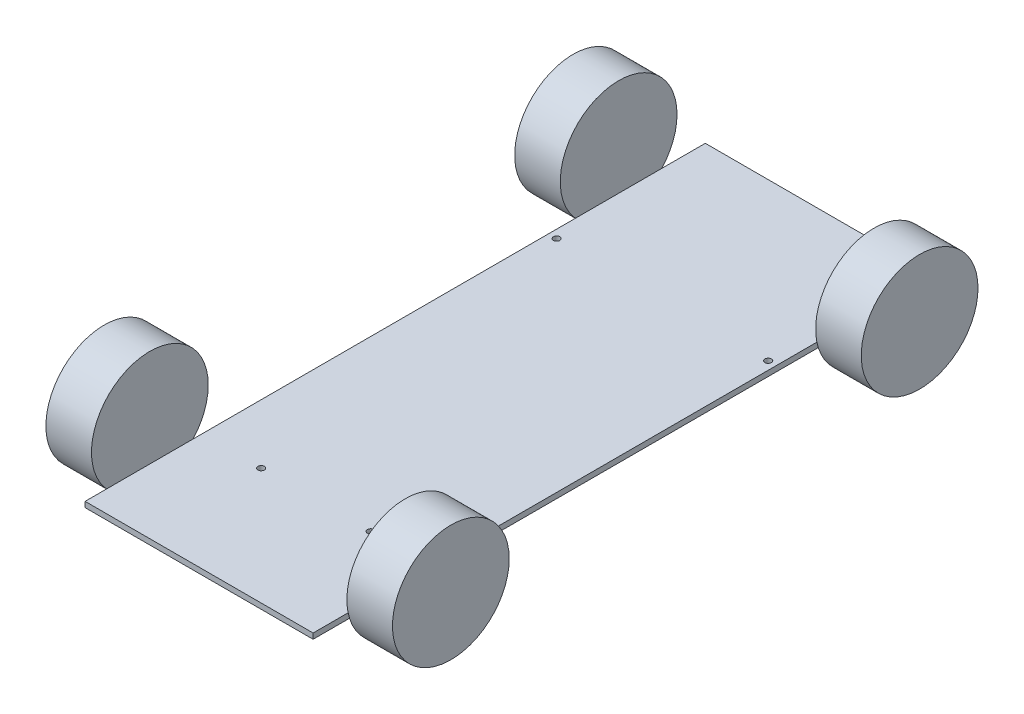
ISO-10303-21;
HEADER;
FILE_DESCRIPTION(('STEP AP214'),'2;1');
FILE_NAME('part.step','',(''),(''),'','','');
FILE_SCHEMA(('AUTOMOTIVE_DESIGN { 1 0 10303 214 1 1 1 1 }'));
ENDSEC;
DATA;
#1=APPLICATION_CONTEXT('core data for automotive mechanical design processes');
#2=APPLICATION_PROTOCOL_DEFINITION('international standard','automotive_design',2000,#1);
#3=PRODUCT_CONTEXT('',#1,'mechanical');
#4=PRODUCT('Part','Part','',(#3));
#5=PRODUCT_RELATED_PRODUCT_CATEGORY('part','',(#4));
#6=PRODUCT_DEFINITION_FORMATION('','',#4);
#7=PRODUCT_DEFINITION_CONTEXT('part definition',#1,'design');
#8=PRODUCT_DEFINITION('design','',#6,#7);
#9=PRODUCT_DEFINITION_SHAPE('','',#8);
#10=(LENGTH_UNIT() NAMED_UNIT(*) SI_UNIT(.MILLI.,.METRE.));
#11=(NAMED_UNIT(*) PLANE_ANGLE_UNIT() SI_UNIT($,.RADIAN.));
#12=(NAMED_UNIT(*) SI_UNIT($,.STERADIAN.) SOLID_ANGLE_UNIT());
#13=UNCERTAINTY_MEASURE_WITH_UNIT(LENGTH_MEASURE(1.E-05),#10,'distance_accuracy_value','');
#14=(GEOMETRIC_REPRESENTATION_CONTEXT(3) GLOBAL_UNCERTAINTY_ASSIGNED_CONTEXT((#13)) GLOBAL_UNIT_ASSIGNED_CONTEXT((#10,
#11,#12)) REPRESENTATION_CONTEXT('',''));
#15=CARTESIAN_POINT('',(0.,0.,0.));
#16=DIRECTION('',(0.,0.,1.));
#17=DIRECTION('',(1.,0.,0.));
#18=AXIS2_PLACEMENT_3D('',#15,#16,#17);
#19=CARTESIAN_POINT('',(-95.,17.,127.));
#20=DIRECTION('',(1.,0.,0.));
#21=DIRECTION('',(0.,0.,1.));
#22=AXIS2_PLACEMENT_3D('',#19,#20,#21);
#23=CYLINDRICAL_SURFACE('',#22,32.);
#24=CARTESIAN_POINT('',(-95.,17.,127.));
#25=DIRECTION('',(1.,0.,0.));
#26=DIRECTION('',(0.,0.,-1.));
#27=AXIS2_PLACEMENT_3D('',#24,#25,#26);
#28=CIRCLE('',#27,32.);
#29=CARTESIAN_POINT('',(-95.,17.,95.));
#30=VERTEX_POINT('',#29);
#31=EDGE_CURVE('E11',#30,#30,#28,.T.);
#32=ORIENTED_EDGE('',*,*,#31,.T.);
#33=EDGE_LOOP('',(#32));
#34=FACE_BOUND('',#33,.T.);
#35=CARTESIAN_POINT('',(-70.,17.,127.));
#36=DIRECTION('',(1.,0.,0.));
#37=DIRECTION('',(0.,0.,-1.));
#38=AXIS2_PLACEMENT_3D('',#35,#36,#37);
#39=CIRCLE('',#38,32.);
#40=CARTESIAN_POINT('',(-70.,17.,95.));
#41=VERTEX_POINT('',#40);
#42=EDGE_CURVE('E42',#41,#41,#39,.T.);
#43=ORIENTED_EDGE('',*,*,#42,.F.);
#44=EDGE_LOOP('',(#43));
#45=FACE_BOUND('',#44,.T.);
#46=ADVANCED_FACE('F39',(#34,#45),#23,.T.);
#47=CARTESIAN_POINT('',(-95.,17.,127.));
#48=DIRECTION('',(-1.,0.,0.));
#49=DIRECTION('',(0.,0.,-1.));
#50=AXIS2_PLACEMENT_3D('',#47,#48,#49);
#51=PLANE('',#50);
#52=ORIENTED_EDGE('',*,*,#31,.F.);
#53=EDGE_LOOP('',(#52));
#54=FACE_BOUND('',#53,.T.);
#55=ADVANCED_FACE('F54',(#54),#51,.T.);
#56=CARTESIAN_POINT('',(-70.,17.,127.));
#57=DIRECTION('',(-1.,0.,0.));
#58=DIRECTION('',(0.,0.,-1.));
#59=AXIS2_PLACEMENT_3D('',#56,#57,#58);
#60=PLANE('',#59);
#61=ORIENTED_EDGE('',*,*,#42,.T.);
#62=EDGE_LOOP('',(#61));
#63=FACE_BOUND('',#62,.T.);
#64=ADVANCED_FACE('F51',(#63),#60,.F.);
#65=CLOSED_SHELL('',(#46,#55,#64));
#66=MANIFOLD_SOLID_BREP('B2',#65);
#67=CARTESIAN_POINT('',(-95.,17.,-130.));
#68=DIRECTION('',(1.,0.,0.));
#69=DIRECTION('',(0.,0.,1.));
#70=AXIS2_PLACEMENT_3D('',#67,#68,#69);
#71=CYLINDRICAL_SURFACE('',#70,32.);
#72=CARTESIAN_POINT('',(-95.,17.,-130.));
#73=DIRECTION('',(1.,0.,0.));
#74=DIRECTION('',(0.,0.,-1.));
#75=AXIS2_PLACEMENT_3D('',#72,#73,#74);
#76=CIRCLE('',#75,32.);
#77=CARTESIAN_POINT('',(-95.,17.,-162.));
#78=VERTEX_POINT('',#77);
#79=EDGE_CURVE('E38',#78,#78,#76,.T.);
#80=ORIENTED_EDGE('',*,*,#79,.T.);
#81=EDGE_LOOP('',(#80));
#82=FACE_BOUND('',#81,.T.);
#83=CARTESIAN_POINT('',(-70.,17.,-130.));
#84=DIRECTION('',(1.,0.,0.));
#85=DIRECTION('',(0.,0.,-1.));
#86=AXIS2_PLACEMENT_3D('',#83,#84,#85);
#87=CIRCLE('',#86,32.);
#88=CARTESIAN_POINT('',(-70.,17.,-162.));
#89=VERTEX_POINT('',#88);
#90=EDGE_CURVE('E90',#89,#89,#87,.T.);
#91=ORIENTED_EDGE('',*,*,#90,.F.);
#92=EDGE_LOOP('',(#91));
#93=FACE_BOUND('',#92,.T.);
#94=ADVANCED_FACE('F87',(#82,#93),#71,.T.);
#95=CARTESIAN_POINT('',(-95.,17.,-130.));
#96=DIRECTION('',(-1.,0.,0.));
#97=DIRECTION('',(0.,0.,-1.));
#98=AXIS2_PLACEMENT_3D('',#95,#96,#97);
#99=PLANE('',#98);
#100=ORIENTED_EDGE('',*,*,#79,.F.);
#101=EDGE_LOOP('',(#100));
#102=FACE_BOUND('',#101,.T.);
#103=ADVANCED_FACE('F102',(#102),#99,.T.);
#104=CARTESIAN_POINT('',(-70.,17.,-130.));
#105=DIRECTION('',(-1.,0.,0.));
#106=DIRECTION('',(0.,0.,-1.));
#107=AXIS2_PLACEMENT_3D('',#104,#105,#106);
#108=PLANE('',#107);
#109=ORIENTED_EDGE('',*,*,#90,.T.);
#110=EDGE_LOOP('',(#109));
#111=FACE_BOUND('',#110,.T.);
#112=ADVANCED_FACE('F99',(#111),#108,.F.);
#113=CLOSED_SHELL('',(#94,#103,#112));
#114=MANIFOLD_SOLID_BREP('B6',#113);
#115=CARTESIAN_POINT('',(95.,17.,127.));
#116=DIRECTION('',(-1.,0.,0.));
#117=DIRECTION('',(0.,0.,1.));
#118=AXIS2_PLACEMENT_3D('',#115,#116,#117);
#119=CYLINDRICAL_SURFACE('',#118,32.);
#120=CARTESIAN_POINT('',(95.,17.,127.));
#121=DIRECTION('',(1.,0.,0.));
#122=DIRECTION('',(0.,0.,-1.));
#123=AXIS2_PLACEMENT_3D('',#120,#121,#122);
#124=CIRCLE('',#123,32.);
#125=CARTESIAN_POINT('',(95.,17.,95.));
#126=VERTEX_POINT('',#125);
#127=EDGE_CURVE('E86',#126,#126,#124,.T.);
#128=ORIENTED_EDGE('',*,*,#127,.F.);
#129=EDGE_LOOP('',(#128));
#130=FACE_BOUND('',#129,.T.);
#131=CARTESIAN_POINT('',(70.,17.,127.));
#132=DIRECTION('',(1.,0.,0.));
#133=DIRECTION('',(0.,0.,-1.));
#134=AXIS2_PLACEMENT_3D('',#131,#132,#133);
#135=CIRCLE('',#134,32.);
#136=CARTESIAN_POINT('',(70.,17.,95.));
#137=VERTEX_POINT('',#136);
#138=EDGE_CURVE('E138',#137,#137,#135,.T.);
#139=ORIENTED_EDGE('',*,*,#138,.T.);
#140=EDGE_LOOP('',(#139));
#141=FACE_BOUND('',#140,.T.);
#142=ADVANCED_FACE('F135',(#130,#141),#119,.T.);
#143=CARTESIAN_POINT('',(95.,17.,127.));
#144=DIRECTION('',(1.,0.,0.));
#145=DIRECTION('',(0.,0.,-1.));
#146=AXIS2_PLACEMENT_3D('',#143,#144,#145);
#147=PLANE('',#146);
#148=ORIENTED_EDGE('',*,*,#127,.T.);
#149=EDGE_LOOP('',(#148));
#150=FACE_BOUND('',#149,.T.);
#151=ADVANCED_FACE('F150',(#150),#147,.T.);
#152=CARTESIAN_POINT('',(70.,17.,127.));
#153=DIRECTION('',(1.,0.,0.));
#154=DIRECTION('',(0.,0.,-1.));
#155=AXIS2_PLACEMENT_3D('',#152,#153,#154);
#156=PLANE('',#155);
#157=ORIENTED_EDGE('',*,*,#138,.F.);
#158=EDGE_LOOP('',(#157));
#159=FACE_BOUND('',#158,.T.);
#160=ADVANCED_FACE('F148',(#159),#156,.F.);
#161=CLOSED_SHELL('',(#142,#151,#160));
#162=MANIFOLD_SOLID_BREP('B33',#161);
#163=CARTESIAN_POINT('',(95.,17.,-130.));
#164=DIRECTION('',(-1.,0.,0.));
#165=DIRECTION('',(0.,0.,1.));
#166=AXIS2_PLACEMENT_3D('',#163,#164,#165);
#167=CYLINDRICAL_SURFACE('',#166,32.);
#168=CARTESIAN_POINT('',(95.,17.,-130.));
#169=DIRECTION('',(1.,0.,0.));
#170=DIRECTION('',(0.,0.,-1.));
#171=AXIS2_PLACEMENT_3D('',#168,#169,#170);
#172=CIRCLE('',#171,32.);
#173=CARTESIAN_POINT('',(95.,17.,-162.));
#174=VERTEX_POINT('',#173);
#175=EDGE_CURVE('E134',#174,#174,#172,.T.);
#176=ORIENTED_EDGE('',*,*,#175,.F.);
#177=EDGE_LOOP('',(#176));
#178=FACE_BOUND('',#177,.T.);
#179=CARTESIAN_POINT('',(70.,17.,-130.));
#180=DIRECTION('',(1.,0.,0.));
#181=DIRECTION('',(0.,0.,-1.));
#182=AXIS2_PLACEMENT_3D('',#179,#180,#181);
#183=CIRCLE('',#182,32.);
#184=CARTESIAN_POINT('',(70.,17.,-162.));
#185=VERTEX_POINT('',#184);
#186=EDGE_CURVE('E187',#185,#185,#183,.T.);
#187=ORIENTED_EDGE('',*,*,#186,.T.);
#188=EDGE_LOOP('',(#187));
#189=FACE_BOUND('',#188,.T.);
#190=ADVANCED_FACE('F184',(#178,#189),#167,.T.);
#191=CARTESIAN_POINT('',(95.,17.,-130.));
#192=DIRECTION('',(1.,0.,0.));
#193=DIRECTION('',(0.,0.,-1.));
#194=AXIS2_PLACEMENT_3D('',#191,#192,#193);
#195=PLANE('',#194);
#196=ORIENTED_EDGE('',*,*,#175,.T.);
#197=EDGE_LOOP('',(#196));
#198=FACE_BOUND('',#197,.T.);
#199=ADVANCED_FACE('F199',(#198),#195,.T.);
#200=CARTESIAN_POINT('',(70.,17.,-130.));
#201=DIRECTION('',(1.,0.,0.));
#202=DIRECTION('',(0.,0.,-1.));
#203=AXIS2_PLACEMENT_3D('',#200,#201,#202);
#204=PLANE('',#203);
#205=ORIENTED_EDGE('',*,*,#186,.F.);
#206=EDGE_LOOP('',(#205));
#207=FACE_BOUND('',#206,.T.);
#208=ADVANCED_FACE('F197',(#207),#204,.F.);
#209=CLOSED_SHELL('',(#190,#199,#208));
#210=MANIFOLD_SOLID_BREP('B81',#209);
#211=CARTESIAN_POINT('',(0.,3.,0.));
#212=DIRECTION('',(0.,1.,0.));
#213=DIRECTION('',(0.,0.,1.));
#214=AXIS2_PLACEMENT_3D('',#211,#212,#213);
#215=PLANE('',#214);
#216=CARTESIAN_POINT('',(-30.,3.,106.));
#217=DIRECTION('',(0.,1.,0.));
#218=DIRECTION('',(0.,0.,1.));
#219=AXIS2_PLACEMENT_3D('',#216,#217,#218);
#220=CIRCLE('',#219,1.778);
#221=CARTESIAN_POINT('',(-30.,3.,107.778));
#222=VERTEX_POINT('',#221);
#223=EDGE_CURVE('E312',#222,#222,#220,.T.);
#224=ORIENTED_EDGE('',*,*,#223,.F.);
#225=EDGE_LOOP('',(#224));
#226=FACE_BOUND('',#225,.T.);
#227=CARTESIAN_POINT('',(-58.0000000000088,3.,-84.));
#228=DIRECTION('',(0.,1.,0.));
#229=DIRECTION('',(0.,0.,1.));
#230=AXIS2_PLACEMENT_3D('',#227,#228,#229);
#231=CIRCLE('',#230,1.77799999999999);
#232=CARTESIAN_POINT('',(-58.0000000000088,3.,-82.222));
#233=VERTEX_POINT('',#232);
#234=EDGE_CURVE('E291',#233,#233,#231,.T.);
#235=ORIENTED_EDGE('',*,*,#234,.F.);
#236=EDGE_LOOP('',(#235));
#237=FACE_BOUND('',#236,.T.);
#238=DIRECTION('',(0.,0.,-1.));
#239=VECTOR('',#238,1.);
#240=CARTESIAN_POINT('',(62.5,3.,-170.));
#241=LINE('',#240,#239);
#242=CARTESIAN_POINT('',(62.5,3.,170.));
#243=VERTEX_POINT('',#242);
#244=CARTESIAN_POINT('',(62.5,3.,-170.));
#245=VERTEX_POINT('',#244);
#246=EDGE_CURVE('E276',#243,#245,#241,.T.);
#247=ORIENTED_EDGE('',*,*,#246,.T.);
#248=DIRECTION('',(-1.,0.,0.));
#249=VECTOR('',#248,1.);
#250=CARTESIAN_POINT('',(-62.5,3.,-170.));
#251=LINE('',#250,#249);
#252=CARTESIAN_POINT('',(-62.5,3.,-170.));
#253=VERTEX_POINT('',#252);
#254=EDGE_CURVE('E271',#245,#253,#251,.T.);
#255=ORIENTED_EDGE('',*,*,#254,.T.);
#256=DIRECTION('',(0.,0.,1.));
#257=VECTOR('',#256,1.);
#258=CARTESIAN_POINT('',(-62.5,3.,-170.));
#259=LINE('',#258,#257);
#260=CARTESIAN_POINT('',(-62.5,3.,170.));
#261=VERTEX_POINT('',#260);
#262=EDGE_CURVE('E274',#253,#261,#259,.T.);
#263=ORIENTED_EDGE('',*,*,#262,.T.);
#264=DIRECTION('',(1.,0.,0.));
#265=VECTOR('',#264,1.);
#266=CARTESIAN_POINT('',(-62.5,3.,170.));
#267=LINE('',#266,#265);
#268=EDGE_CURVE('E241',#261,#243,#267,.T.);
#269=ORIENTED_EDGE('',*,*,#268,.T.);
#270=EDGE_LOOP('',(#247,#255,#263,#269));
#271=FACE_BOUND('',#270,.T.);
#272=CARTESIAN_POINT('',(58.0000000000088,3.,-84.));
#273=DIRECTION('',(0.,1.,0.));
#274=DIRECTION('',(0.,0.,1.));
#275=AXIS2_PLACEMENT_3D('',#272,#273,#274);
#276=CIRCLE('',#275,1.77799999999999);
#277=CARTESIAN_POINT('',(58.0000000000088,3.,-82.222));
#278=VERTEX_POINT('',#277);
#279=EDGE_CURVE('E306',#278,#278,#276,.T.);
#280=ORIENTED_EDGE('',*,*,#279,.F.);
#281=EDGE_LOOP('',(#280));
#282=FACE_BOUND('',#281,.T.);
#283=CARTESIAN_POINT('',(30.,3.,106.));
#284=DIRECTION('',(0.,1.,0.));
#285=DIRECTION('',(0.,0.,1.));
#286=AXIS2_PLACEMENT_3D('',#283,#284,#285);
#287=CIRCLE('',#286,1.778);
#288=CARTESIAN_POINT('',(30.,3.,107.778));
#289=VERTEX_POINT('',#288);
#290=EDGE_CURVE('E318',#289,#289,#287,.T.);
#291=ORIENTED_EDGE('',*,*,#290,.F.);
#292=EDGE_LOOP('',(#291));
#293=FACE_BOUND('',#292,.T.);
#294=ADVANCED_FACE('F224',(#226,#237,#271,#282,#293),#215,.T.);
#295=CARTESIAN_POINT('',(0.,0.,0.));
#296=DIRECTION('',(0.,1.,0.));
#297=DIRECTION('',(0.,0.,1.));
#298=AXIS2_PLACEMENT_3D('',#295,#296,#297);
#299=PLANE('',#298);
#300=DIRECTION('',(0.,0.,-1.));
#301=VECTOR('',#300,1.);
#302=CARTESIAN_POINT('',(62.5,0.,-170.));
#303=LINE('',#302,#301);
#304=CARTESIAN_POINT('',(62.5,0.,170.));
#305=VERTEX_POINT('',#304);
#306=CARTESIAN_POINT('',(62.5,0.,-170.));
#307=VERTEX_POINT('',#306);
#308=EDGE_CURVE('E288',#305,#307,#303,.T.);
#309=ORIENTED_EDGE('',*,*,#308,.F.);
#310=DIRECTION('',(1.,0.,0.));
#311=VECTOR('',#310,1.);
#312=CARTESIAN_POINT('',(-62.5,0.,170.));
#313=LINE('',#312,#311);
#314=CARTESIAN_POINT('',(-62.5,0.,170.));
#315=VERTEX_POINT('',#314);
#316=EDGE_CURVE('E264',#315,#305,#313,.T.);
#317=ORIENTED_EDGE('',*,*,#316,.F.);
#318=DIRECTION('',(0.,0.,1.));
#319=VECTOR('',#318,1.);
#320=CARTESIAN_POINT('',(-62.5,0.,-170.));
#321=LINE('',#320,#319);
#322=CARTESIAN_POINT('',(-62.5,0.,-170.));
#323=VERTEX_POINT('',#322);
#324=EDGE_CURVE('E258',#323,#315,#321,.T.);
#325=ORIENTED_EDGE('',*,*,#324,.F.);
#326=DIRECTION('',(-1.,0.,0.));
#327=VECTOR('',#326,1.);
#328=CARTESIAN_POINT('',(-62.5,0.,-170.));
#329=LINE('',#328,#327);
#330=EDGE_CURVE('E280',#307,#323,#329,.T.);
#331=ORIENTED_EDGE('',*,*,#330,.F.);
#332=EDGE_LOOP('',(#309,#317,#325,#331));
#333=FACE_BOUND('',#332,.T.);
#334=CARTESIAN_POINT('',(-58.0000000000088,0.,-84.));
#335=DIRECTION('',(0.,1.,0.));
#336=DIRECTION('',(0.,0.,1.));
#337=AXIS2_PLACEMENT_3D('',#334,#335,#336);
#338=CIRCLE('',#337,1.77799999999999);
#339=CARTESIAN_POINT('',(-58.0000000000088,0.,-82.222));
#340=VERTEX_POINT('',#339);
#341=EDGE_CURVE('E303',#340,#340,#338,.T.);
#342=ORIENTED_EDGE('',*,*,#341,.T.);
#343=EDGE_LOOP('',(#342));
#344=FACE_BOUND('',#343,.T.);
#345=CARTESIAN_POINT('',(58.0000000000088,0.,-84.));
#346=DIRECTION('',(0.,1.,0.));
#347=DIRECTION('',(0.,0.,1.));
#348=AXIS2_PLACEMENT_3D('',#345,#346,#347);
#349=CIRCLE('',#348,1.77799999999999);
#350=CARTESIAN_POINT('',(58.0000000000088,0.,-82.222));
#351=VERTEX_POINT('',#350);
#352=EDGE_CURVE('E309',#351,#351,#349,.T.);
#353=ORIENTED_EDGE('',*,*,#352,.T.);
#354=EDGE_LOOP('',(#353));
#355=FACE_BOUND('',#354,.T.);
#356=CARTESIAN_POINT('',(-30.,0.,106.));
#357=DIRECTION('',(0.,1.,0.));
#358=DIRECTION('',(0.,0.,1.));
#359=AXIS2_PLACEMENT_3D('',#356,#357,#358);
#360=CIRCLE('',#359,1.778);
#361=CARTESIAN_POINT('',(-30.,0.,107.778));
#362=VERTEX_POINT('',#361);
#363=EDGE_CURVE('E315',#362,#362,#360,.T.);
#364=ORIENTED_EDGE('',*,*,#363,.T.);
#365=EDGE_LOOP('',(#364));
#366=FACE_BOUND('',#365,.T.);
#367=CARTESIAN_POINT('',(30.,0.,106.));
#368=DIRECTION('',(0.,1.,0.));
#369=DIRECTION('',(0.,0.,1.));
#370=AXIS2_PLACEMENT_3D('',#367,#368,#369);
#371=CIRCLE('',#370,1.778);
#372=CARTESIAN_POINT('',(30.,0.,107.778));
#373=VERTEX_POINT('',#372);
#374=EDGE_CURVE('E321',#373,#373,#371,.T.);
#375=ORIENTED_EDGE('',*,*,#374,.T.);
#376=EDGE_LOOP('',(#375));
#377=FACE_BOUND('',#376,.T.);
#378=ADVANCED_FACE('F299',(#333,#344,#355,#366,#377),#299,.F.);
#379=CARTESIAN_POINT('',(62.5,3.,-170.));
#380=DIRECTION('',(-1.,0.,0.));
#381=DIRECTION('',(0.,0.,1.));
#382=AXIS2_PLACEMENT_3D('',#379,#380,#381);
#383=PLANE('',#382);
#384=ORIENTED_EDGE('',*,*,#308,.T.);
#385=DIRECTION('',(0.,-1.,0.));
#386=VECTOR('',#385,1.);
#387=CARTESIAN_POINT('',(62.5,3.,-170.));
#388=LINE('',#387,#386);
#389=EDGE_CURVE('E182',#245,#307,#388,.T.);
#390=ORIENTED_EDGE('',*,*,#389,.F.);
#391=ORIENTED_EDGE('',*,*,#246,.F.);
#392=DIRECTION('',(0.,-1.,0.));
#393=VECTOR('',#392,1.);
#394=CARTESIAN_POINT('',(62.5,3.,170.));
#395=LINE('',#394,#393);
#396=EDGE_CURVE('E284',#243,#305,#395,.T.);
#397=ORIENTED_EDGE('',*,*,#396,.T.);
#398=EDGE_LOOP('',(#384,#390,#391,#397));
#399=FACE_BOUND('',#398,.T.);
#400=ADVANCED_FACE('F226',(#399),#383,.F.);
#401=CARTESIAN_POINT('',(-62.5,3.,-170.));
#402=DIRECTION('',(0.,0.,1.));
#403=DIRECTION('',(1.,0.,0.));
#404=AXIS2_PLACEMENT_3D('',#401,#402,#403);
#405=PLANE('',#404);
#406=ORIENTED_EDGE('',*,*,#330,.T.);
#407=DIRECTION('',(0.,-1.,0.));
#408=VECTOR('',#407,1.);
#409=CARTESIAN_POINT('',(-62.5,3.,-170.));
#410=LINE('',#409,#408);
#411=EDGE_CURVE('E233',#253,#323,#410,.T.);
#412=ORIENTED_EDGE('',*,*,#411,.F.);
#413=ORIENTED_EDGE('',*,*,#254,.F.);
#414=ORIENTED_EDGE('',*,*,#389,.T.);
#415=EDGE_LOOP('',(#406,#412,#413,#414));
#416=FACE_BOUND('',#415,.T.);
#417=ADVANCED_FACE('F279',(#416),#405,.F.);
#418=CARTESIAN_POINT('',(-62.5,3.,-170.));
#419=DIRECTION('',(1.,0.,0.));
#420=DIRECTION('',(0.,0.,-1.));
#421=AXIS2_PLACEMENT_3D('',#418,#419,#420);
#422=PLANE('',#421);
#423=ORIENTED_EDGE('',*,*,#324,.T.);
#424=DIRECTION('',(0.,-1.,0.));
#425=VECTOR('',#424,1.);
#426=CARTESIAN_POINT('',(-62.5,3.,170.));
#427=LINE('',#426,#425);
#428=EDGE_CURVE('E281',#261,#315,#427,.T.);
#429=ORIENTED_EDGE('',*,*,#428,.F.);
#430=ORIENTED_EDGE('',*,*,#262,.F.);
#431=ORIENTED_EDGE('',*,*,#411,.T.);
#432=EDGE_LOOP('',(#423,#429,#430,#431));
#433=FACE_BOUND('',#432,.T.);
#434=ADVANCED_FACE('F282',(#433),#422,.F.);
#435=CARTESIAN_POINT('',(-62.5,3.,170.));
#436=DIRECTION('',(0.,0.,-1.));
#437=DIRECTION('',(-1.,0.,0.));
#438=AXIS2_PLACEMENT_3D('',#435,#436,#437);
#439=PLANE('',#438);
#440=ORIENTED_EDGE('',*,*,#316,.T.);
#441=ORIENTED_EDGE('',*,*,#396,.F.);
#442=ORIENTED_EDGE('',*,*,#268,.F.);
#443=ORIENTED_EDGE('',*,*,#428,.T.);
#444=EDGE_LOOP('',(#440,#441,#442,#443));
#445=FACE_BOUND('',#444,.T.);
#446=ADVANCED_FACE('F296',(#445),#439,.F.);
#447=CARTESIAN_POINT('',(-58.0000000000088,3.,-84.));
#448=DIRECTION('',(0.,-1.,0.));
#449=DIRECTION('',(0.,0.,-1.));
#450=AXIS2_PLACEMENT_3D('',#447,#448,#449);
#451=CYLINDRICAL_SURFACE('',#450,1.77799999999999);
#452=ORIENTED_EDGE('',*,*,#234,.T.);
#453=EDGE_LOOP('',(#452));
#454=FACE_BOUND('',#453,.T.);
#455=ORIENTED_EDGE('',*,*,#341,.F.);
#456=EDGE_LOOP('',(#455));
#457=FACE_BOUND('',#456,.T.);
#458=ADVANCED_FACE('F340',(#454,#457),#451,.F.);
#459=CARTESIAN_POINT('',(58.0000000000088,3.,-84.));
#460=DIRECTION('',(0.,-1.,0.));
#461=DIRECTION('',(0.,0.,-1.));
#462=AXIS2_PLACEMENT_3D('',#459,#460,#461);
#463=CYLINDRICAL_SURFACE('',#462,1.77799999999999);
#464=ORIENTED_EDGE('',*,*,#279,.T.);
#465=EDGE_LOOP('',(#464));
#466=FACE_BOUND('',#465,.T.);
#467=ORIENTED_EDGE('',*,*,#352,.F.);
#468=EDGE_LOOP('',(#467));
#469=FACE_BOUND('',#468,.T.);
#470=ADVANCED_FACE('F386',(#466,#469),#463,.F.);
#471=CARTESIAN_POINT('',(-30.,3.,106.));
#472=DIRECTION('',(0.,-1.,0.));
#473=DIRECTION('',(0.,0.,-1.));
#474=AXIS2_PLACEMENT_3D('',#471,#472,#473);
#475=CYLINDRICAL_SURFACE('',#474,1.778);
#476=ORIENTED_EDGE('',*,*,#223,.T.);
#477=EDGE_LOOP('',(#476));
#478=FACE_BOUND('',#477,.T.);
#479=ORIENTED_EDGE('',*,*,#363,.F.);
#480=EDGE_LOOP('',(#479));
#481=FACE_BOUND('',#480,.T.);
#482=ADVANCED_FACE('F394',(#478,#481),#475,.F.);
#483=CARTESIAN_POINT('',(30.,3.,106.));
#484=DIRECTION('',(0.,-1.,0.));
#485=DIRECTION('',(0.,0.,-1.));
#486=AXIS2_PLACEMENT_3D('',#483,#484,#485);
#487=CYLINDRICAL_SURFACE('',#486,1.778);
#488=ORIENTED_EDGE('',*,*,#290,.T.);
#489=EDGE_LOOP('',(#488));
#490=FACE_BOUND('',#489,.T.);
#491=ORIENTED_EDGE('',*,*,#374,.F.);
#492=EDGE_LOOP('',(#491));
#493=FACE_BOUND('',#492,.T.);
#494=ADVANCED_FACE('F327',(#490,#493),#487,.F.);
#495=CLOSED_SHELL('',(#294,#378,#400,#417,#434,#446,#458,#470,#482,#494));
#496=MANIFOLD_SOLID_BREP('B129',#495);
#497=ADVANCED_BREP_SHAPE_REPRESENTATION('',(#18,#66,#114,#162,#210,#496),#14);
#498=SHAPE_DEFINITION_REPRESENTATION(#9,#497);
ENDSEC;
END-ISO-10303-21;
